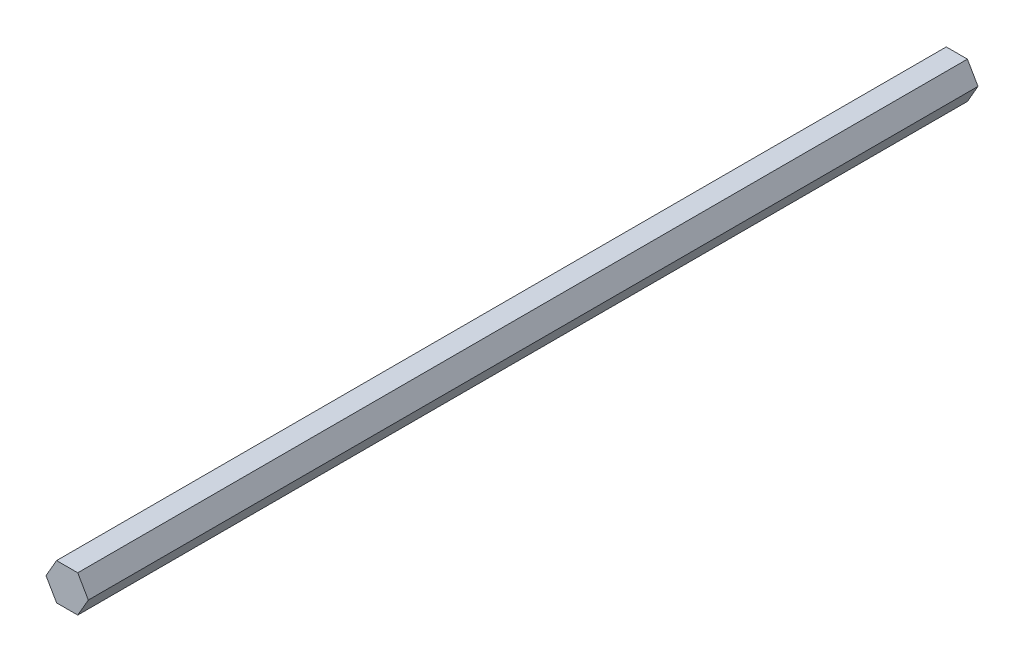
ISO-10303-21;
HEADER;
FILE_DESCRIPTION(('STEP AP214'),'2;1');
FILE_NAME('part.step','',(''),(''),'','','');
FILE_SCHEMA(('AUTOMOTIVE_DESIGN { 1 0 10303 214 1 1 1 1 }'));
ENDSEC;
DATA;
#1=APPLICATION_CONTEXT('core data for automotive mechanical design processes');
#2=APPLICATION_PROTOCOL_DEFINITION('international standard','automotive_design',2000,#1);
#3=PRODUCT_CONTEXT('',#1,'mechanical');
#4=PRODUCT('Part','Part','',(#3));
#5=PRODUCT_RELATED_PRODUCT_CATEGORY('part','',(#4));
#6=PRODUCT_DEFINITION_FORMATION('','',#4);
#7=PRODUCT_DEFINITION_CONTEXT('part definition',#1,'design');
#8=PRODUCT_DEFINITION('design','',#6,#7);
#9=PRODUCT_DEFINITION_SHAPE('','',#8);
#10=(LENGTH_UNIT() NAMED_UNIT(*) SI_UNIT(.MILLI.,.METRE.));
#11=(NAMED_UNIT(*) PLANE_ANGLE_UNIT() SI_UNIT($,.RADIAN.));
#12=(NAMED_UNIT(*) SI_UNIT($,.STERADIAN.) SOLID_ANGLE_UNIT());
#13=UNCERTAINTY_MEASURE_WITH_UNIT(LENGTH_MEASURE(1.E-05),#10,'distance_accuracy_value','');
#14=(GEOMETRIC_REPRESENTATION_CONTEXT(3) GLOBAL_UNCERTAINTY_ASSIGNED_CONTEXT((#13)) GLOBAL_UNIT_ASSIGNED_CONTEXT((#10,
#11,#12)) REPRESENTATION_CONTEXT('',''));
#15=CARTESIAN_POINT('',(0.,0.,0.));
#16=DIRECTION('',(0.,0.,1.));
#17=DIRECTION('',(1.,0.,0.));
#18=AXIS2_PLACEMENT_3D('',#15,#16,#17);
#19=CARTESIAN_POINT('',(0.499407982849026,-0.865,42.));
#20=DIRECTION('',(-0.866025403784439,0.5,0.));
#21=DIRECTION('',(-0.5,-0.866025403784439,0.));
#22=AXIS2_PLACEMENT_3D('',#19,#20,#21);
#23=PLANE('',#22);
#24=DIRECTION('',(0.5,0.866025403784439,0.));
#25=VECTOR('',#24,1.);
#26=CARTESIAN_POINT('',(0.499407982849026,-0.865,0.));
#27=LINE('',#26,#25);
#28=CARTESIAN_POINT('',(0.499407982849026,-0.865,0.));
#29=VERTEX_POINT('',#28);
#30=CARTESIAN_POINT('',(0.998815965698053,0.,0.));
#31=VERTEX_POINT('',#30);
#32=EDGE_CURVE('E121',#29,#31,#27,.T.);
#33=ORIENTED_EDGE('',*,*,#32,.T.);
#34=DIRECTION('',(0.,0.,-1.));
#35=VECTOR('',#34,1.);
#36=CARTESIAN_POINT('',(0.998815965698053,0.,42.));
#37=LINE('',#36,#35);
#38=CARTESIAN_POINT('',(0.998815965698053,0.,42.));
#39=VERTEX_POINT('',#38);
#40=EDGE_CURVE('E11',#39,#31,#37,.T.);
#41=ORIENTED_EDGE('',*,*,#40,.F.);
#42=DIRECTION('',(0.5,0.866025403784439,0.));
#43=VECTOR('',#42,1.);
#44=CARTESIAN_POINT('',(0.499407982849026,-0.865,42.));
#45=LINE('',#44,#43);
#46=CARTESIAN_POINT('',(0.499407982849026,-0.865,42.));
#47=VERTEX_POINT('',#46);
#48=EDGE_CURVE('E131',#47,#39,#45,.T.);
#49=ORIENTED_EDGE('',*,*,#48,.F.);
#50=DIRECTION('',(0.,0.,-1.));
#51=VECTOR('',#50,1.);
#52=CARTESIAN_POINT('',(0.499407982849026,-0.865,42.));
#53=LINE('',#52,#51);
#54=EDGE_CURVE('E117',#47,#29,#53,.T.);
#55=ORIENTED_EDGE('',*,*,#54,.T.);
#56=EDGE_LOOP('',(#33,#41,#49,#55));
#57=FACE_BOUND('',#56,.T.);
#58=ADVANCED_FACE('F37',(#57),#23,.F.);
#59=CARTESIAN_POINT('',(0.998815965698053,0.,42.));
#60=DIRECTION('',(-0.866025403784439,-0.5,0.));
#61=DIRECTION('',(0.5,-0.866025403784439,0.));
#62=AXIS2_PLACEMENT_3D('',#59,#60,#61);
#63=PLANE('',#62);
#64=DIRECTION('',(-0.5,0.866025403784439,0.));
#65=VECTOR('',#64,1.);
#66=CARTESIAN_POINT('',(0.998815965698053,0.,0.));
#67=LINE('',#66,#65);
#68=CARTESIAN_POINT('',(0.499407982849027,0.865,0.));
#69=VERTEX_POINT('',#68);
#70=EDGE_CURVE('E124',#31,#69,#67,.T.);
#71=ORIENTED_EDGE('',*,*,#70,.T.);
#72=DIRECTION('',(0.,0.,-1.));
#73=VECTOR('',#72,1.);
#74=CARTESIAN_POINT('',(0.499407982849027,0.865,42.));
#75=LINE('',#74,#73);
#76=CARTESIAN_POINT('',(0.499407982849027,0.865,42.));
#77=VERTEX_POINT('',#76);
#78=EDGE_CURVE('E45',#77,#69,#75,.T.);
#79=ORIENTED_EDGE('',*,*,#78,.F.);
#80=DIRECTION('',(-0.5,0.866025403784439,0.));
#81=VECTOR('',#80,1.);
#82=CARTESIAN_POINT('',(0.998815965698053,0.,42.));
#83=LINE('',#82,#81);
#84=EDGE_CURVE('E90',#39,#77,#83,.T.);
#85=ORIENTED_EDGE('',*,*,#84,.F.);
#86=ORIENTED_EDGE('',*,*,#40,.T.);
#87=EDGE_LOOP('',(#71,#79,#85,#86));
#88=FACE_BOUND('',#87,.T.);
#89=ADVANCED_FACE('F155',(#88),#63,.F.);
#90=CARTESIAN_POINT('',(0.499407982849027,0.865,42.));
#91=DIRECTION('',(0.,-1.,0.));
#92=DIRECTION('',(1.,0.,0.));
#93=AXIS2_PLACEMENT_3D('',#90,#91,#92);
#94=PLANE('',#93);
#95=DIRECTION('',(-1.,0.,0.));
#96=VECTOR('',#95,1.);
#97=CARTESIAN_POINT('',(0.499407982849027,0.865,0.));
#98=LINE('',#97,#96);
#99=CARTESIAN_POINT('',(-0.499407982849026,0.865,0.));
#100=VERTEX_POINT('',#99);
#101=EDGE_CURVE('E126',#69,#100,#98,.T.);
#102=ORIENTED_EDGE('',*,*,#101,.T.);
#103=DIRECTION('',(0.,0.,-1.));
#104=VECTOR('',#103,1.);
#105=CARTESIAN_POINT('',(-0.499407982849026,0.865,42.));
#106=LINE('',#105,#104);
#107=CARTESIAN_POINT('',(-0.499407982849026,0.865,42.));
#108=VERTEX_POINT('',#107);
#109=EDGE_CURVE('E112',#108,#100,#106,.T.);
#110=ORIENTED_EDGE('',*,*,#109,.F.);
#111=DIRECTION('',(-1.,0.,0.));
#112=VECTOR('',#111,1.);
#113=CARTESIAN_POINT('',(0.499407982849027,0.865,42.));
#114=LINE('',#113,#112);
#115=EDGE_CURVE('E103',#77,#108,#114,.T.);
#116=ORIENTED_EDGE('',*,*,#115,.F.);
#117=ORIENTED_EDGE('',*,*,#78,.T.);
#118=EDGE_LOOP('',(#102,#110,#116,#117));
#119=FACE_BOUND('',#118,.T.);
#120=ADVANCED_FACE('F137',(#119),#94,.F.);
#121=CARTESIAN_POINT('',(-0.499407982849026,0.865,42.));
#122=DIRECTION('',(0.866025403784438,-0.5,0.));
#123=DIRECTION('',(0.5,0.866025403784439,0.));
#124=AXIS2_PLACEMENT_3D('',#121,#122,#123);
#125=PLANE('',#124);
#126=DIRECTION('',(-0.5,-0.866025403784438,0.));
#127=VECTOR('',#126,1.);
#128=CARTESIAN_POINT('',(-0.499407982849026,0.865,0.));
#129=LINE('',#128,#127);
#130=CARTESIAN_POINT('',(-0.998815965698053,0.,0.));
#131=VERTEX_POINT('',#130);
#132=EDGE_CURVE('E111',#100,#131,#129,.T.);
#133=ORIENTED_EDGE('',*,*,#132,.T.);
#134=DIRECTION('',(0.,0.,-1.));
#135=VECTOR('',#134,1.);
#136=CARTESIAN_POINT('',(-0.998815965698053,0.,42.));
#137=LINE('',#136,#135);
#138=CARTESIAN_POINT('',(-0.998815965698053,0.,42.));
#139=VERTEX_POINT('',#138);
#140=EDGE_CURVE('E108',#139,#131,#137,.T.);
#141=ORIENTED_EDGE('',*,*,#140,.F.);
#142=DIRECTION('',(-0.5,-0.866025403784438,0.));
#143=VECTOR('',#142,1.);
#144=CARTESIAN_POINT('',(-0.499407982849026,0.865,42.));
#145=LINE('',#144,#143);
#146=EDGE_CURVE('E97',#108,#139,#145,.T.);
#147=ORIENTED_EDGE('',*,*,#146,.F.);
#148=ORIENTED_EDGE('',*,*,#109,.T.);
#149=EDGE_LOOP('',(#133,#141,#147,#148));
#150=FACE_BOUND('',#149,.T.);
#151=ADVANCED_FACE('F109',(#150),#125,.F.);
#152=CARTESIAN_POINT('',(-0.998815965698053,0.,42.));
#153=DIRECTION('',(0.866025403784439,0.5,0.));
#154=DIRECTION('',(-0.5,0.866025403784439,0.));
#155=AXIS2_PLACEMENT_3D('',#152,#153,#154);
#156=PLANE('',#155);
#157=DIRECTION('',(0.5,-0.866025403784439,0.));
#158=VECTOR('',#157,1.);
#159=CARTESIAN_POINT('',(-0.998815965698053,0.,0.));
#160=LINE('',#159,#158);
#161=CARTESIAN_POINT('',(-0.499407982849027,-0.865,0.));
#162=VERTEX_POINT('',#161);
#163=EDGE_CURVE('E76',#131,#162,#160,.T.);
#164=ORIENTED_EDGE('',*,*,#163,.T.);
#165=DIRECTION('',(0.,0.,-1.));
#166=VECTOR('',#165,1.);
#167=CARTESIAN_POINT('',(-0.499407982849027,-0.865,42.));
#168=LINE('',#167,#166);
#169=CARTESIAN_POINT('',(-0.499407982849027,-0.865,42.));
#170=VERTEX_POINT('',#169);
#171=EDGE_CURVE('E113',#170,#162,#168,.T.);
#172=ORIENTED_EDGE('',*,*,#171,.F.);
#173=DIRECTION('',(0.5,-0.866025403784439,0.));
#174=VECTOR('',#173,1.);
#175=CARTESIAN_POINT('',(-0.998815965698053,0.,42.));
#176=LINE('',#175,#174);
#177=EDGE_CURVE('E101',#139,#170,#176,.T.);
#178=ORIENTED_EDGE('',*,*,#177,.F.);
#179=ORIENTED_EDGE('',*,*,#140,.T.);
#180=EDGE_LOOP('',(#164,#172,#178,#179));
#181=FACE_BOUND('',#180,.T.);
#182=ADVANCED_FACE('F115',(#181),#156,.F.);
#183=CARTESIAN_POINT('',(-0.499407982849027,-0.865,42.));
#184=DIRECTION('',(0.,1.,0.));
#185=DIRECTION('',(0.,0.,1.));
#186=AXIS2_PLACEMENT_3D('',#183,#184,#185);
#187=PLANE('',#186);
#188=DIRECTION('',(1.,0.,0.));
#189=VECTOR('',#188,1.);
#190=CARTESIAN_POINT('',(-0.499407982849027,-0.865,0.));
#191=LINE('',#190,#189);
#192=EDGE_CURVE('E82',#162,#29,#191,.T.);
#193=ORIENTED_EDGE('',*,*,#192,.T.);
#194=ORIENTED_EDGE('',*,*,#54,.F.);
#195=DIRECTION('',(1.,0.,0.));
#196=VECTOR('',#195,1.);
#197=CARTESIAN_POINT('',(-0.499407982849027,-0.865,42.));
#198=LINE('',#197,#196);
#199=EDGE_CURVE('E53',#170,#47,#198,.T.);
#200=ORIENTED_EDGE('',*,*,#199,.F.);
#201=ORIENTED_EDGE('',*,*,#171,.T.);
#202=EDGE_LOOP('',(#193,#194,#200,#201));
#203=FACE_BOUND('',#202,.T.);
#204=ADVANCED_FACE('F144',(#203),#187,.F.);
#205=CARTESIAN_POINT('',(0.,0.,42.));
#206=DIRECTION('',(0.,0.,1.));
#207=DIRECTION('',(1.,0.,0.));
#208=AXIS2_PLACEMENT_3D('',#205,#206,#207);
#209=PLANE('',#208);
#210=ORIENTED_EDGE('',*,*,#48,.T.);
#211=ORIENTED_EDGE('',*,*,#84,.T.);
#212=ORIENTED_EDGE('',*,*,#115,.T.);
#213=ORIENTED_EDGE('',*,*,#146,.T.);
#214=ORIENTED_EDGE('',*,*,#177,.T.);
#215=ORIENTED_EDGE('',*,*,#199,.T.);
#216=EDGE_LOOP('',(#210,#211,#212,#213,#214,#215));
#217=FACE_BOUND('',#216,.T.);
#218=ADVANCED_FACE('F99',(#217),#209,.T.);
#219=CARTESIAN_POINT('',(0.,0.,0.));
#220=DIRECTION('',(0.,0.,1.));
#221=DIRECTION('',(1.,0.,0.));
#222=AXIS2_PLACEMENT_3D('',#219,#220,#221);
#223=PLANE('',#222);
#224=ORIENTED_EDGE('',*,*,#32,.F.);
#225=ORIENTED_EDGE('',*,*,#192,.F.);
#226=ORIENTED_EDGE('',*,*,#163,.F.);
#227=ORIENTED_EDGE('',*,*,#132,.F.);
#228=ORIENTED_EDGE('',*,*,#101,.F.);
#229=ORIENTED_EDGE('',*,*,#70,.F.);
#230=EDGE_LOOP('',(#224,#225,#226,#227,#228,#229));
#231=FACE_BOUND('',#230,.T.);
#232=ADVANCED_FACE('F140',(#231),#223,.F.);
#233=CLOSED_SHELL('',(#58,#89,#120,#151,#182,#204,#218,#232));
#234=MANIFOLD_SOLID_BREP('B2',#233);
#235=ADVANCED_BREP_SHAPE_REPRESENTATION('',(#18,#234),#14);
#236=SHAPE_DEFINITION_REPRESENTATION(#9,#235);
ENDSEC;
END-ISO-10303-21;
